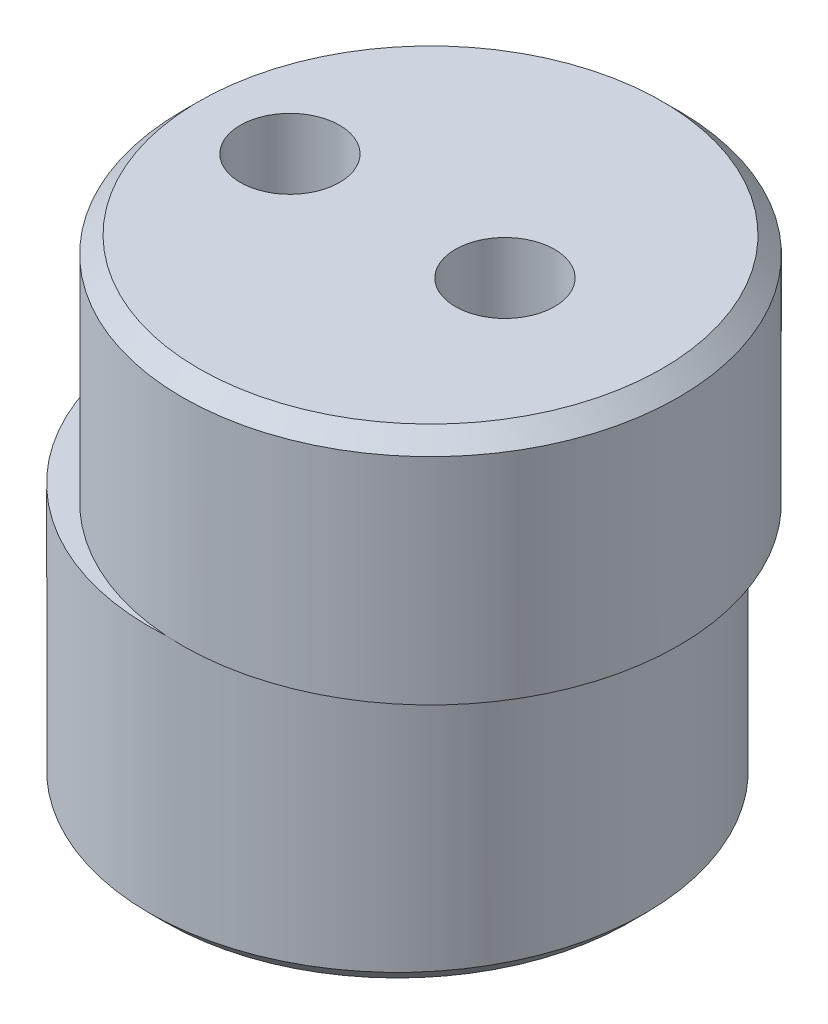
ISO-10303-21;
HEADER;
FILE_DESCRIPTION(('STEP AP214'),'2;1');
FILE_NAME('part.step','',(''),(''),'','','');
FILE_SCHEMA(('AUTOMOTIVE_DESIGN { 1 0 10303 214 1 1 1 1 }'));
ENDSEC;
DATA;
#1=APPLICATION_CONTEXT('core data for automotive mechanical design processes');
#2=APPLICATION_PROTOCOL_DEFINITION('international standard','automotive_design',2000,#1);
#3=PRODUCT_CONTEXT('',#1,'mechanical');
#4=PRODUCT('Part','Part','',(#3));
#5=PRODUCT_RELATED_PRODUCT_CATEGORY('part','',(#4));
#6=PRODUCT_DEFINITION_FORMATION('','',#4);
#7=PRODUCT_DEFINITION_CONTEXT('part definition',#1,'design');
#8=PRODUCT_DEFINITION('design','',#6,#7);
#9=PRODUCT_DEFINITION_SHAPE('','',#8);
#10=(LENGTH_UNIT() NAMED_UNIT(*) SI_UNIT(.MILLI.,.METRE.));
#11=(NAMED_UNIT(*) PLANE_ANGLE_UNIT() SI_UNIT($,.RADIAN.));
#12=(NAMED_UNIT(*) SI_UNIT($,.STERADIAN.) SOLID_ANGLE_UNIT());
#13=UNCERTAINTY_MEASURE_WITH_UNIT(LENGTH_MEASURE(1.E-05),#10,'distance_accuracy_value','');
#14=(GEOMETRIC_REPRESENTATION_CONTEXT(3) GLOBAL_UNCERTAINTY_ASSIGNED_CONTEXT((#13)) GLOBAL_UNIT_ASSIGNED_CONTEXT((#10,
#11,#12)) REPRESENTATION_CONTEXT('',''));
#15=CARTESIAN_POINT('',(0.,0.,0.));
#16=DIRECTION('',(0.,0.,1.));
#17=DIRECTION('',(1.,0.,0.));
#18=AXIS2_PLACEMENT_3D('',#15,#16,#17);
#19=CARTESIAN_POINT('',(0.,8.,0.));
#20=DIRECTION('',(0.,-1.,0.));
#21=DIRECTION('',(0.,0.,-1.));
#22=AXIS2_PLACEMENT_3D('',#19,#20,#21);
#23=CYLINDRICAL_SURFACE('',#22,7.5);
#24=CARTESIAN_POINT('',(0.,0.5,0.));
#25=DIRECTION('',(0.,1.,0.));
#26=DIRECTION('',(0.,0.,1.));
#27=AXIS2_PLACEMENT_3D('',#24,#25,#26);
#28=CIRCLE('',#27,7.5);
#29=CARTESIAN_POINT('',(0.,0.5,7.5));
#30=VERTEX_POINT('',#29);
#31=EDGE_CURVE('E63',#30,#30,#28,.T.);
#32=ORIENTED_EDGE('',*,*,#31,.T.);
#33=EDGE_LOOP('',(#32));
#34=FACE_BOUND('',#33,.T.);
#35=CARTESIAN_POINT('',(0.,8.,0.));
#36=DIRECTION('',(0.,1.,0.));
#37=DIRECTION('',(0.,0.,1.));
#38=AXIS2_PLACEMENT_3D('',#35,#36,#37);
#39=CIRCLE('',#38,7.5);
#40=CARTESIAN_POINT('',(0.5,8.,7.48331477354788));
#41=VERTEX_POINT('',#40);
#42=CARTESIAN_POINT('',(0.5,8.,-7.48331477354788));
#43=VERTEX_POINT('',#42);
#44=EDGE_CURVE('E58',#41,#43,#39,.T.);
#45=ORIENTED_EDGE('',*,*,#44,.F.);
#46=EDGE_CURVE('E59',#43,#41,#39,.T.);
#47=ORIENTED_EDGE('',*,*,#46,.F.);
#48=EDGE_LOOP('',(#45,#47));
#49=FACE_BOUND('',#48,.T.);
#50=ADVANCED_FACE('F38',(#34,#49),#23,.T.);
#51=CARTESIAN_POINT('',(0.,8.,0.));
#52=DIRECTION('',(0.,1.,0.));
#53=DIRECTION('',(0.,0.,1.));
#54=AXIS2_PLACEMENT_3D('',#51,#52,#53);
#55=PLANE('',#54);
#56=CARTESIAN_POINT('',(1.,8.,0.));
#57=DIRECTION('',(0.,1.,0.));
#58=DIRECTION('',(0.,0.,1.));
#59=AXIS2_PLACEMENT_3D('',#56,#57,#58);
#60=CIRCLE('',#59,7.5);
#61=EDGE_CURVE('E53',#43,#41,#60,.T.);
#62=ORIENTED_EDGE('',*,*,#61,.F.);
#63=ORIENTED_EDGE('',*,*,#46,.T.);
#64=EDGE_LOOP('',(#62,#63));
#65=FACE_BOUND('',#64,.T.);
#66=ADVANCED_FACE('F65',(#65),#55,.T.);
#67=CARTESIAN_POINT('',(0.,0.,0.));
#68=DIRECTION('',(0.,1.,0.));
#69=DIRECTION('',(0.,0.,1.));
#70=AXIS2_PLACEMENT_3D('',#67,#68,#69);
#71=PLANE('',#70);
#72=CARTESIAN_POINT('',(0.,0.,0.));
#73=DIRECTION('',(0.,1.,0.));
#74=DIRECTION('',(0.,0.,1.));
#75=AXIS2_PLACEMENT_3D('',#72,#73,#74);
#76=CIRCLE('',#75,7.);
#77=CARTESIAN_POINT('',(0.,0.,7.));
#78=VERTEX_POINT('',#77);
#79=EDGE_CURVE('E78',#78,#78,#76,.F.);
#80=ORIENTED_EDGE('',*,*,#79,.T.);
#81=EDGE_LOOP('',(#80));
#82=FACE_BOUND('',#81,.T.);
#83=CARTESIAN_POINT('',(-3.25,0.,0.));
#84=DIRECTION('',(0.,-1.,0.));
#85=DIRECTION('',(0.,0.,-1.));
#86=AXIS2_PLACEMENT_3D('',#83,#84,#85);
#87=CIRCLE('',#86,1.5);
#88=CARTESIAN_POINT('',(-3.25,0.,-1.5));
#89=VERTEX_POINT('',#88);
#90=EDGE_CURVE('E132',#89,#89,#87,.T.);
#91=ORIENTED_EDGE('',*,*,#90,.F.);
#92=EDGE_LOOP('',(#91));
#93=FACE_BOUND('',#92,.T.);
#94=CARTESIAN_POINT('',(3.25,0.,0.));
#95=DIRECTION('',(0.,-1.,0.));
#96=DIRECTION('',(0.,0.,-1.));
#97=AXIS2_PLACEMENT_3D('',#94,#95,#96);
#98=CIRCLE('',#97,1.5);
#99=CARTESIAN_POINT('',(3.25,0.,-1.5));
#100=VERTEX_POINT('',#99);
#101=EDGE_CURVE('E73',#100,#100,#98,.T.);
#102=ORIENTED_EDGE('',*,*,#101,.F.);
#103=EDGE_LOOP('',(#102));
#104=FACE_BOUND('',#103,.T.);
#105=ADVANCED_FACE('F101',(#82,#93,#104),#71,.F.);
#106=CARTESIAN_POINT('',(1.,8.,0.));
#107=DIRECTION('',(0.,1.,0.));
#108=DIRECTION('',(0.,0.,1.));
#109=AXIS2_PLACEMENT_3D('',#106,#107,#108);
#110=PLANE('',#109);
#111=EDGE_CURVE('E66',#41,#43,#60,.T.);
#112=ORIENTED_EDGE('',*,*,#111,.F.);
#113=ORIENTED_EDGE('',*,*,#44,.T.);
#114=EDGE_LOOP('',(#112,#113));
#115=FACE_BOUND('',#114,.T.);
#116=ADVANCED_FACE('F67',(#115),#110,.F.);
#117=CARTESIAN_POINT('',(1.,15.,0.));
#118=DIRECTION('',(0.,-1.,0.));
#119=DIRECTION('',(0.,0.,-1.));
#120=AXIS2_PLACEMENT_3D('',#117,#118,#119);
#121=CYLINDRICAL_SURFACE('',#120,7.5);
#122=CARTESIAN_POINT('',(1.,14.5,0.));
#123=DIRECTION('',(0.,1.,0.));
#124=DIRECTION('',(0.,0.,1.));
#125=AXIS2_PLACEMENT_3D('',#122,#123,#124);
#126=CIRCLE('',#125,7.5);
#127=CARTESIAN_POINT('',(1.,14.5,7.5));
#128=VERTEX_POINT('',#127);
#129=EDGE_CURVE('E11',#128,#128,#126,.F.);
#130=ORIENTED_EDGE('',*,*,#129,.T.);
#131=EDGE_LOOP('',(#130));
#132=FACE_BOUND('',#131,.T.);
#133=ORIENTED_EDGE('',*,*,#61,.T.);
#134=ORIENTED_EDGE('',*,*,#111,.T.);
#135=EDGE_LOOP('',(#133,#134));
#136=FACE_BOUND('',#135,.T.);
#137=ADVANCED_FACE('F71',(#132,#136),#121,.T.);
#138=CARTESIAN_POINT('',(1.,15.,0.));
#139=DIRECTION('',(0.,1.,0.));
#140=DIRECTION('',(0.,0.,1.));
#141=AXIS2_PLACEMENT_3D('',#138,#139,#140);
#142=PLANE('',#141);
#143=CARTESIAN_POINT('',(1.,15.,0.));
#144=DIRECTION('',(0.,1.,0.));
#145=DIRECTION('',(0.,0.,1.));
#146=AXIS2_PLACEMENT_3D('',#143,#144,#145);
#147=CIRCLE('',#146,7.00000000000001);
#148=CARTESIAN_POINT('',(1.,15.,7.00000000000001));
#149=VERTEX_POINT('',#148);
#150=EDGE_CURVE('E47',#149,#149,#147,.T.);
#151=ORIENTED_EDGE('',*,*,#150,.T.);
#152=EDGE_LOOP('',(#151));
#153=FACE_BOUND('',#152,.T.);
#154=CARTESIAN_POINT('',(-3.25,15.,0.));
#155=DIRECTION('',(0.,-1.,0.));
#156=DIRECTION('',(0.,0.,-1.));
#157=AXIS2_PLACEMENT_3D('',#154,#155,#156);
#158=CIRCLE('',#157,1.5);
#159=CARTESIAN_POINT('',(-3.25,15.,-1.5));
#160=VERTEX_POINT('',#159);
#161=EDGE_CURVE('E69',#160,#160,#158,.T.);
#162=ORIENTED_EDGE('',*,*,#161,.T.);
#163=EDGE_LOOP('',(#162));
#164=FACE_BOUND('',#163,.T.);
#165=CARTESIAN_POINT('',(3.25,15.,0.));
#166=DIRECTION('',(0.,-1.,0.));
#167=DIRECTION('',(0.,0.,-1.));
#168=AXIS2_PLACEMENT_3D('',#165,#166,#167);
#169=CIRCLE('',#168,1.5);
#170=CARTESIAN_POINT('',(3.25,15.,-1.5));
#171=VERTEX_POINT('',#170);
#172=EDGE_CURVE('E134',#171,#171,#169,.T.);
#173=ORIENTED_EDGE('',*,*,#172,.T.);
#174=EDGE_LOOP('',(#173));
#175=FACE_BOUND('',#174,.T.);
#176=ADVANCED_FACE('F83',(#153,#164,#175),#142,.T.);
#177=CARTESIAN_POINT('',(3.25,15.,0.));
#178=DIRECTION('',(0.,-1.,0.));
#179=DIRECTION('',(0.,0.,-1.));
#180=AXIS2_PLACEMENT_3D('',#177,#178,#179);
#181=CYLINDRICAL_SURFACE('',#180,1.5);
#182=ORIENTED_EDGE('',*,*,#172,.F.);
#183=EDGE_LOOP('',(#182));
#184=FACE_BOUND('',#183,.T.);
#185=ORIENTED_EDGE('',*,*,#101,.T.);
#186=EDGE_LOOP('',(#185));
#187=FACE_BOUND('',#186,.T.);
#188=ADVANCED_FACE('F119',(#184,#187),#181,.F.);
#189=CARTESIAN_POINT('',(-3.25,15.,0.));
#190=DIRECTION('',(0.,-1.,0.));
#191=DIRECTION('',(0.,0.,-1.));
#192=AXIS2_PLACEMENT_3D('',#189,#190,#191);
#193=CYLINDRICAL_SURFACE('',#192,1.5);
#194=ORIENTED_EDGE('',*,*,#161,.F.);
#195=EDGE_LOOP('',(#194));
#196=FACE_BOUND('',#195,.T.);
#197=ORIENTED_EDGE('',*,*,#90,.T.);
#198=EDGE_LOOP('',(#197));
#199=FACE_BOUND('',#198,.T.);
#200=ADVANCED_FACE('F92',(#196,#199),#193,.F.);
#201=CARTESIAN_POINT('',(0.,0.5,0.));
#202=DIRECTION('',(0.,1.,0.));
#203=DIRECTION('',(0.,0.,1.));
#204=AXIS2_PLACEMENT_3D('',#201,#202,#203);
#205=CONICAL_SURFACE('',#204,7.5,0.785398163397448);
#206=ORIENTED_EDGE('',*,*,#79,.F.);
#207=EDGE_LOOP('',(#206));
#208=FACE_BOUND('',#207,.T.);
#209=ORIENTED_EDGE('',*,*,#31,.F.);
#210=EDGE_LOOP('',(#209));
#211=FACE_BOUND('',#210,.T.);
#212=ADVANCED_FACE('F87',(#208,#211),#205,.T.);
#213=CARTESIAN_POINT('',(1.,15.,0.));
#214=DIRECTION('',(0.,-1.,0.));
#215=DIRECTION('',(0.,0.,-1.));
#216=AXIS2_PLACEMENT_3D('',#213,#214,#215);
#217=CONICAL_SURFACE('',#216,7.00000000000001,0.785398163397444);
#218=ORIENTED_EDGE('',*,*,#129,.F.);
#219=EDGE_LOOP('',(#218));
#220=FACE_BOUND('',#219,.T.);
#221=ORIENTED_EDGE('',*,*,#150,.F.);
#222=EDGE_LOOP('',(#221));
#223=FACE_BOUND('',#222,.T.);
#224=ADVANCED_FACE('F41',(#220,#223),#217,.T.);
#225=CLOSED_SHELL('',(#50,#66,#105,#116,#137,#176,#188,#200,#212,#224));
#226=MANIFOLD_SOLID_BREP('B2',#225);
#227=ADVANCED_BREP_SHAPE_REPRESENTATION('',(#18,#226),#14);
#228=SHAPE_DEFINITION_REPRESENTATION(#9,#227);
ENDSEC;
END-ISO-10303-21;
